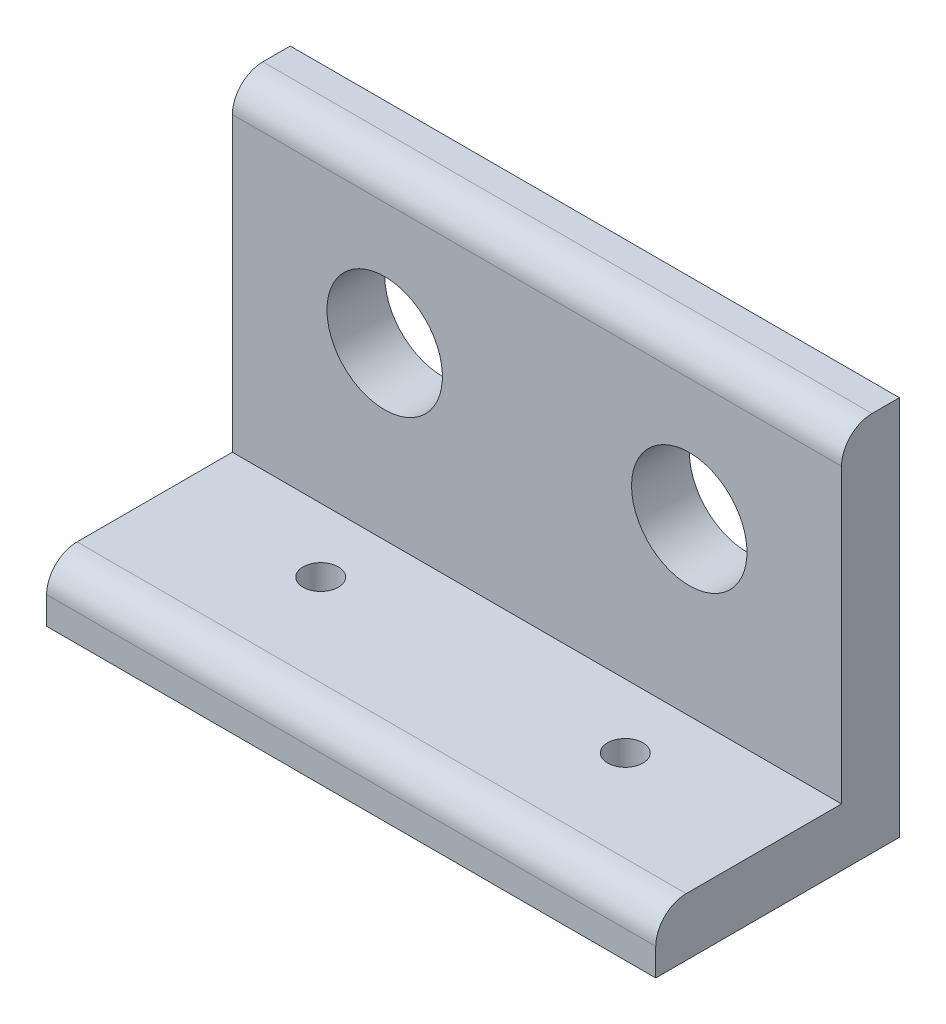
ISO-10303-21;
HEADER;
FILE_DESCRIPTION(('STEP AP214'),'2;1');
FILE_NAME('part.step','',(''),(''),'','','');
FILE_SCHEMA(('AUTOMOTIVE_DESIGN { 1 0 10303 214 1 1 1 1 }'));
ENDSEC;
DATA;
#1=APPLICATION_CONTEXT('core data for automotive mechanical design processes');
#2=APPLICATION_PROTOCOL_DEFINITION('international standard','automotive_design',2000,#1);
#3=PRODUCT_CONTEXT('',#1,'mechanical');
#4=PRODUCT('Part','Part','',(#3));
#5=PRODUCT_RELATED_PRODUCT_CATEGORY('part','',(#4));
#6=PRODUCT_DEFINITION_FORMATION('','',#4);
#7=PRODUCT_DEFINITION_CONTEXT('part definition',#1,'design');
#8=PRODUCT_DEFINITION('design','',#6,#7);
#9=PRODUCT_DEFINITION_SHAPE('','',#8);
#10=(LENGTH_UNIT() NAMED_UNIT(*) SI_UNIT(.MILLI.,.METRE.));
#11=(NAMED_UNIT(*) PLANE_ANGLE_UNIT() SI_UNIT($,.RADIAN.));
#12=(NAMED_UNIT(*) SI_UNIT($,.STERADIAN.) SOLID_ANGLE_UNIT());
#13=UNCERTAINTY_MEASURE_WITH_UNIT(LENGTH_MEASURE(1.E-05),#10,'distance_accuracy_value','');
#14=(GEOMETRIC_REPRESENTATION_CONTEXT(3) GLOBAL_UNCERTAINTY_ASSIGNED_CONTEXT((#13)) GLOBAL_UNIT_ASSIGNED_CONTEXT((#10,
#11,#12)) REPRESENTATION_CONTEXT('',''));
#15=CARTESIAN_POINT('',(0.,0.,0.));
#16=DIRECTION('',(0.,0.,1.));
#17=DIRECTION('',(1.,0.,0.));
#18=AXIS2_PLACEMENT_3D('',#15,#16,#17);
#19=CARTESIAN_POINT('',(0.,4.826,0.));
#20=DIRECTION('',(0.,-1.,0.));
#21=DIRECTION('',(0.,0.,-1.));
#22=AXIS2_PLACEMENT_3D('',#19,#20,#21);
#23=PLANE('',#22);
#24=CARTESIAN_POINT('',(38.1,4.826,-10.16));
#25=DIRECTION('',(0.,1.,0.));
#26=DIRECTION('',(0.,0.,1.));
#27=AXIS2_PLACEMENT_3D('',#24,#25,#26);
#28=CIRCLE('',#27,1.4732);
#29=CARTESIAN_POINT('',(38.1,4.826,-8.6868));
#30=VERTEX_POINT('',#29);
#31=EDGE_CURVE('E144',#30,#30,#28,.T.);
#32=ORIENTED_EDGE('',*,*,#31,.F.);
#33=EDGE_LOOP('',(#32));
#34=FACE_BOUND('',#33,.T.);
#35=CARTESIAN_POINT('',(12.7,4.826,-10.16));
#36=DIRECTION('',(0.,1.,0.));
#37=DIRECTION('',(0.,0.,1.));
#38=AXIS2_PLACEMENT_3D('',#35,#36,#37);
#39=CIRCLE('',#38,1.4732);
#40=CARTESIAN_POINT('',(12.7,4.826,-8.6868));
#41=VERTEX_POINT('',#40);
#42=EDGE_CURVE('E150',#41,#41,#39,.T.);
#43=ORIENTED_EDGE('',*,*,#42,.F.);
#44=EDGE_LOOP('',(#43));
#45=FACE_BOUND('',#44,.T.);
#46=DIRECTION('',(0.,0.,1.));
#47=VECTOR('',#46,1.);
#48=CARTESIAN_POINT('',(0.,4.826,0.));
#49=LINE('',#48,#47);
#50=CARTESIAN_POINT('',(0.,4.826,-15.494));
#51=VERTEX_POINT('',#50);
#52=CARTESIAN_POINT('',(0.,4.826,-2.54));
#53=VERTEX_POINT('',#52);
#54=EDGE_CURVE('E156',#51,#53,#49,.T.);
#55=ORIENTED_EDGE('',*,*,#54,.T.);
#56=DIRECTION('',(1.,0.,0.));
#57=VECTOR('',#56,1.);
#58=CARTESIAN_POINT('',(0.,4.826,-2.54));
#59=LINE('',#58,#57);
#60=CARTESIAN_POINT('',(50.8,4.826,-2.54));
#61=VERTEX_POINT('',#60);
#62=EDGE_CURVE('E174',#53,#61,#59,.T.);
#63=ORIENTED_EDGE('',*,*,#62,.T.);
#64=DIRECTION('',(0.,0.,-1.));
#65=VECTOR('',#64,1.);
#66=CARTESIAN_POINT('',(50.8,4.826,0.));
#67=LINE('',#66,#65);
#68=CARTESIAN_POINT('',(50.8,4.826,-15.494));
#69=VERTEX_POINT('',#68);
#70=EDGE_CURVE('E159',#61,#69,#67,.T.);
#71=ORIENTED_EDGE('',*,*,#70,.T.);
#72=DIRECTION('',(1.,0.,0.));
#73=VECTOR('',#72,1.);
#74=CARTESIAN_POINT('',(0.,4.826,-15.494));
#75=LINE('',#74,#73);
#76=EDGE_CURVE('E139',#51,#69,#75,.T.);
#77=ORIENTED_EDGE('',*,*,#76,.F.);
#78=EDGE_LOOP('',(#55,#63,#71,#77));
#79=FACE_BOUND('',#78,.T.);
#80=ADVANCED_FACE('F43',(#34,#45,#79),#23,.F.);
#81=CARTESIAN_POINT('',(0.,0.,0.));
#82=DIRECTION('',(0.,-1.,0.));
#83=DIRECTION('',(0.,0.,-1.));
#84=AXIS2_PLACEMENT_3D('',#81,#82,#83);
#85=PLANE('',#84);
#86=CARTESIAN_POINT('',(12.7,0.,-10.16));
#87=DIRECTION('',(0.,1.,0.));
#88=DIRECTION('',(0.,0.,1.));
#89=AXIS2_PLACEMENT_3D('',#86,#87,#88);
#90=CIRCLE('',#89,1.4732);
#91=CARTESIAN_POINT('',(12.7,0.,-8.6868));
#92=VERTEX_POINT('',#91);
#93=EDGE_CURVE('E147',#92,#92,#90,.T.);
#94=ORIENTED_EDGE('',*,*,#93,.T.);
#95=EDGE_LOOP('',(#94));
#96=FACE_BOUND('',#95,.T.);
#97=DIRECTION('',(0.,0.,1.));
#98=VECTOR('',#97,1.);
#99=CARTESIAN_POINT('',(0.,0.,0.));
#100=LINE('',#99,#98);
#101=CARTESIAN_POINT('',(0.,0.,-20.32));
#102=VERTEX_POINT('',#101);
#103=CARTESIAN_POINT('',(0.,0.,0.));
#104=VERTEX_POINT('',#103);
#105=EDGE_CURVE('E153',#102,#104,#100,.T.);
#106=ORIENTED_EDGE('',*,*,#105,.F.);
#107=DIRECTION('',(-1.,0.,0.));
#108=VECTOR('',#107,1.);
#109=CARTESIAN_POINT('',(0.,0.,-20.32));
#110=LINE('',#109,#108);
#111=CARTESIAN_POINT('',(50.8,0.,-20.32));
#112=VERTEX_POINT('',#111);
#113=EDGE_CURVE('E160',#112,#102,#110,.T.);
#114=ORIENTED_EDGE('',*,*,#113,.F.);
#115=DIRECTION('',(0.,0.,-1.));
#116=VECTOR('',#115,1.);
#117=CARTESIAN_POINT('',(50.8,0.,0.));
#118=LINE('',#117,#116);
#119=CARTESIAN_POINT('',(50.8,0.,0.));
#120=VERTEX_POINT('',#119);
#121=EDGE_CURVE('E125',#120,#112,#118,.T.);
#122=ORIENTED_EDGE('',*,*,#121,.F.);
#123=DIRECTION('',(1.,0.,0.));
#124=VECTOR('',#123,1.);
#125=CARTESIAN_POINT('',(0.,0.,0.));
#126=LINE('',#125,#124);
#127=EDGE_CURVE('E165',#104,#120,#126,.T.);
#128=ORIENTED_EDGE('',*,*,#127,.F.);
#129=EDGE_LOOP('',(#106,#114,#122,#128));
#130=FACE_BOUND('',#129,.T.);
#131=CARTESIAN_POINT('',(38.1,0.,-10.16));
#132=DIRECTION('',(0.,1.,0.));
#133=DIRECTION('',(0.,0.,1.));
#134=AXIS2_PLACEMENT_3D('',#131,#132,#133);
#135=CIRCLE('',#134,1.4732);
#136=CARTESIAN_POINT('',(38.1,0.,-8.6868));
#137=VERTEX_POINT('',#136);
#138=EDGE_CURVE('E143',#137,#137,#135,.T.);
#139=ORIENTED_EDGE('',*,*,#138,.T.);
#140=EDGE_LOOP('',(#139));
#141=FACE_BOUND('',#140,.T.);
#142=ADVANCED_FACE('F217',(#96,#130,#141),#85,.T.);
#143=CARTESIAN_POINT('',(0.,4.826,0.));
#144=DIRECTION('',(1.,0.,0.));
#145=DIRECTION('',(0.,0.,-1.));
#146=AXIS2_PLACEMENT_3D('',#143,#144,#145);
#147=PLANE('',#146);
#148=DIRECTION('',(0.,-1.,0.));
#149=VECTOR('',#148,1.);
#150=CARTESIAN_POINT('',(0.,4.826,0.));
#151=LINE('',#150,#149);
#152=CARTESIAN_POINT('',(0.,2.286,0.));
#153=VERTEX_POINT('',#152);
#154=EDGE_CURVE('E172',#153,#104,#151,.T.);
#155=ORIENTED_EDGE('',*,*,#154,.F.);
#156=CARTESIAN_POINT('',(0.,2.286,-2.54));
#157=DIRECTION('',(1.,0.,0.));
#158=DIRECTION('',(0.,0.,-1.));
#159=AXIS2_PLACEMENT_3D('',#156,#157,#158);
#160=CIRCLE('',#159,2.54);
#161=EDGE_CURVE('E184',#153,#53,#160,.F.);
#162=ORIENTED_EDGE('',*,*,#161,.T.);
#163=ORIENTED_EDGE('',*,*,#54,.F.);
#164=DIRECTION('',(0.,-1.,0.));
#165=VECTOR('',#164,1.);
#166=CARTESIAN_POINT('',(0.,31.75,-15.494));
#167=LINE('',#166,#165);
#168=CARTESIAN_POINT('',(0.,29.21,-15.494));
#169=VERTEX_POINT('',#168);
#170=EDGE_CURVE('E135',#169,#51,#167,.T.);
#171=ORIENTED_EDGE('',*,*,#170,.F.);
#172=CARTESIAN_POINT('',(0.,29.21,-18.034));
#173=DIRECTION('',(1.,0.,0.));
#174=DIRECTION('',(0.,0.,-1.));
#175=AXIS2_PLACEMENT_3D('',#172,#173,#174);
#176=CIRCLE('',#175,2.54);
#177=CARTESIAN_POINT('',(0.,31.75,-18.034));
#178=VERTEX_POINT('',#177);
#179=EDGE_CURVE('E60',#169,#178,#176,.F.);
#180=ORIENTED_EDGE('',*,*,#179,.T.);
#181=DIRECTION('',(0.,0.,1.));
#182=VECTOR('',#181,1.);
#183=CARTESIAN_POINT('',(0.,31.75,-20.32));
#184=LINE('',#183,#182);
#185=CARTESIAN_POINT('',(0.,31.75,-20.32));
#186=VERTEX_POINT('',#185);
#187=EDGE_CURVE('E118',#186,#178,#184,.T.);
#188=ORIENTED_EDGE('',*,*,#187,.F.);
#189=DIRECTION('',(0.,-1.,0.));
#190=VECTOR('',#189,1.);
#191=CARTESIAN_POINT('',(0.,4.826,-20.32));
#192=LINE('',#191,#190);
#193=EDGE_CURVE('E129',#186,#102,#192,.T.);
#194=ORIENTED_EDGE('',*,*,#193,.T.);
#195=ORIENTED_EDGE('',*,*,#105,.T.);
#196=EDGE_LOOP('',(#155,#162,#163,#171,#180,#188,#194,#195));
#197=FACE_BOUND('',#196,.T.);
#198=ADVANCED_FACE('F206',(#197),#147,.F.);
#199=CARTESIAN_POINT('',(0.,4.826,0.));
#200=DIRECTION('',(0.,0.,-1.));
#201=DIRECTION('',(-1.,0.,0.));
#202=AXIS2_PLACEMENT_3D('',#199,#200,#201);
#203=PLANE('',#202);
#204=DIRECTION('',(0.,-1.,0.));
#205=VECTOR('',#204,1.);
#206=CARTESIAN_POINT('',(50.8,4.826,0.));
#207=LINE('',#206,#205);
#208=CARTESIAN_POINT('',(50.8,2.286,0.));
#209=VERTEX_POINT('',#208);
#210=EDGE_CURVE('E128',#209,#120,#207,.T.);
#211=ORIENTED_EDGE('',*,*,#210,.F.);
#212=DIRECTION('',(1.,0.,0.));
#213=VECTOR('',#212,1.);
#214=CARTESIAN_POINT('',(0.,2.286,0.));
#215=LINE('',#214,#213);
#216=EDGE_CURVE('E181',#209,#153,#215,.F.);
#217=ORIENTED_EDGE('',*,*,#216,.T.);
#218=ORIENTED_EDGE('',*,*,#154,.T.);
#219=ORIENTED_EDGE('',*,*,#127,.T.);
#220=EDGE_LOOP('',(#211,#217,#218,#219));
#221=FACE_BOUND('',#220,.T.);
#222=ADVANCED_FACE('F213',(#221),#203,.F.);
#223=CARTESIAN_POINT('',(50.8,4.826,0.));
#224=DIRECTION('',(-1.,0.,0.));
#225=DIRECTION('',(0.,0.,1.));
#226=AXIS2_PLACEMENT_3D('',#223,#224,#225);
#227=PLANE('',#226);
#228=ORIENTED_EDGE('',*,*,#70,.F.);
#229=CARTESIAN_POINT('',(50.8,2.286,-2.54));
#230=DIRECTION('',(-1.,0.,0.));
#231=DIRECTION('',(0.,0.,1.));
#232=AXIS2_PLACEMENT_3D('',#229,#230,#231);
#233=CIRCLE('',#232,2.54);
#234=EDGE_CURVE('E179',#61,#209,#233,.F.);
#235=ORIENTED_EDGE('',*,*,#234,.T.);
#236=ORIENTED_EDGE('',*,*,#210,.T.);
#237=ORIENTED_EDGE('',*,*,#121,.T.);
#238=DIRECTION('',(0.,-1.,0.));
#239=VECTOR('',#238,1.);
#240=CARTESIAN_POINT('',(50.8,4.826,-20.32));
#241=LINE('',#240,#239);
#242=CARTESIAN_POINT('',(50.8,31.75,-20.32));
#243=VERTEX_POINT('',#242);
#244=EDGE_CURVE('E121',#243,#112,#241,.T.);
#245=ORIENTED_EDGE('',*,*,#244,.F.);
#246=DIRECTION('',(0.,0.,-1.));
#247=VECTOR('',#246,1.);
#248=CARTESIAN_POINT('',(50.8,31.75,-20.32));
#249=LINE('',#248,#247);
#250=CARTESIAN_POINT('',(50.8,31.75,-18.034));
#251=VERTEX_POINT('',#250);
#252=EDGE_CURVE('E111',#251,#243,#249,.T.);
#253=ORIENTED_EDGE('',*,*,#252,.F.);
#254=CARTESIAN_POINT('',(50.8,29.21,-18.034));
#255=DIRECTION('',(-1.,0.,0.));
#256=DIRECTION('',(0.,0.,1.));
#257=AXIS2_PLACEMENT_3D('',#254,#255,#256);
#258=CIRCLE('',#257,2.54);
#259=CARTESIAN_POINT('',(50.8,29.21,-15.494));
#260=VERTEX_POINT('',#259);
#261=EDGE_CURVE('E177',#251,#260,#258,.F.);
#262=ORIENTED_EDGE('',*,*,#261,.T.);
#263=DIRECTION('',(0.,-1.,0.));
#264=VECTOR('',#263,1.);
#265=CARTESIAN_POINT('',(50.8,31.75,-15.494));
#266=LINE('',#265,#264);
#267=EDGE_CURVE('E133',#260,#69,#266,.T.);
#268=ORIENTED_EDGE('',*,*,#267,.T.);
#269=EDGE_LOOP('',(#228,#235,#236,#237,#245,#253,#262,#268));
#270=FACE_BOUND('',#269,.T.);
#271=ADVANCED_FACE('F123',(#270),#227,.F.);
#272=CARTESIAN_POINT('',(0.,4.826,-20.32));
#273=DIRECTION('',(0.,0.,1.));
#274=DIRECTION('',(1.,0.,0.));
#275=AXIS2_PLACEMENT_3D('',#272,#273,#274);
#276=PLANE('',#275);
#277=CARTESIAN_POINT('',(38.1,19.05,-20.32));
#278=DIRECTION('',(0.,0.,-1.));
#279=DIRECTION('',(-1.,0.,0.));
#280=AXIS2_PLACEMENT_3D('',#277,#278,#279);
#281=CIRCLE('',#280,4.8133);
#282=CARTESIAN_POINT('',(33.2867,19.05,-20.32));
#283=VERTEX_POINT('',#282);
#284=EDGE_CURVE('E188',#283,#283,#281,.T.);
#285=ORIENTED_EDGE('',*,*,#284,.F.);
#286=EDGE_LOOP('',(#285));
#287=FACE_BOUND('',#286,.T.);
#288=CARTESIAN_POINT('',(12.7,19.05,-20.32));
#289=DIRECTION('',(0.,0.,-1.));
#290=DIRECTION('',(-1.,0.,0.));
#291=AXIS2_PLACEMENT_3D('',#288,#289,#290);
#292=CIRCLE('',#291,4.8133);
#293=CARTESIAN_POINT('',(7.8867,19.05,-20.32));
#294=VERTEX_POINT('',#293);
#295=EDGE_CURVE('E193',#294,#294,#292,.T.);
#296=ORIENTED_EDGE('',*,*,#295,.F.);
#297=EDGE_LOOP('',(#296));
#298=FACE_BOUND('',#297,.T.);
#299=ORIENTED_EDGE('',*,*,#113,.T.);
#300=ORIENTED_EDGE('',*,*,#193,.F.);
#301=DIRECTION('',(-1.,0.,0.));
#302=VECTOR('',#301,1.);
#303=CARTESIAN_POINT('',(0.,31.75,-20.32));
#304=LINE('',#303,#302);
#305=EDGE_CURVE('E115',#243,#186,#304,.T.);
#306=ORIENTED_EDGE('',*,*,#305,.F.);
#307=ORIENTED_EDGE('',*,*,#244,.T.);
#308=EDGE_LOOP('',(#299,#300,#306,#307));
#309=FACE_BOUND('',#308,.T.);
#310=ADVANCED_FACE('F131',(#287,#298,#309),#276,.F.);
#311=CARTESIAN_POINT('',(12.7,4.826,-10.16));
#312=DIRECTION('',(0.,-1.,0.));
#313=DIRECTION('',(0.,0.,-1.));
#314=AXIS2_PLACEMENT_3D('',#311,#312,#313);
#315=CYLINDRICAL_SURFACE('',#314,1.4732);
#316=ORIENTED_EDGE('',*,*,#42,.T.);
#317=EDGE_LOOP('',(#316));
#318=FACE_BOUND('',#317,.T.);
#319=ORIENTED_EDGE('',*,*,#93,.F.);
#320=EDGE_LOOP('',(#319));
#321=FACE_BOUND('',#320,.T.);
#322=ADVANCED_FACE('F226',(#318,#321),#315,.F.);
#323=CARTESIAN_POINT('',(38.1,4.826,-10.16));
#324=DIRECTION('',(0.,-1.,0.));
#325=DIRECTION('',(0.,0.,-1.));
#326=AXIS2_PLACEMENT_3D('',#323,#324,#325);
#327=CYLINDRICAL_SURFACE('',#326,1.4732);
#328=ORIENTED_EDGE('',*,*,#31,.T.);
#329=EDGE_LOOP('',(#328));
#330=FACE_BOUND('',#329,.T.);
#331=ORIENTED_EDGE('',*,*,#138,.F.);
#332=EDGE_LOOP('',(#331));
#333=FACE_BOUND('',#332,.T.);
#334=ADVANCED_FACE('F224',(#330,#333),#327,.F.);
#335=CARTESIAN_POINT('',(0.,31.75,-15.494));
#336=DIRECTION('',(0.,0.,-1.));
#337=DIRECTION('',(-1.,0.,0.));
#338=AXIS2_PLACEMENT_3D('',#335,#336,#337);
#339=PLANE('',#338);
#340=CARTESIAN_POINT('',(38.1,19.05,-15.494));
#341=DIRECTION('',(0.,0.,-1.));
#342=DIRECTION('',(-1.,0.,0.));
#343=AXIS2_PLACEMENT_3D('',#340,#341,#342);
#344=CIRCLE('',#343,4.8133);
#345=CARTESIAN_POINT('',(33.2867,19.05,-15.494));
#346=VERTEX_POINT('',#345);
#347=EDGE_CURVE('E47',#346,#346,#344,.T.);
#348=ORIENTED_EDGE('',*,*,#347,.T.);
#349=EDGE_LOOP('',(#348));
#350=FACE_BOUND('',#349,.T.);
#351=CARTESIAN_POINT('',(12.7,19.05,-15.494));
#352=DIRECTION('',(0.,0.,-1.));
#353=DIRECTION('',(-1.,0.,0.));
#354=AXIS2_PLACEMENT_3D('',#351,#352,#353);
#355=CIRCLE('',#354,4.8133);
#356=CARTESIAN_POINT('',(7.8867,19.05,-15.494));
#357=VERTEX_POINT('',#356);
#358=EDGE_CURVE('E186',#357,#357,#355,.T.);
#359=ORIENTED_EDGE('',*,*,#358,.T.);
#360=EDGE_LOOP('',(#359));
#361=FACE_BOUND('',#360,.T.);
#362=ORIENTED_EDGE('',*,*,#267,.F.);
#363=DIRECTION('',(1.,0.,0.));
#364=VECTOR('',#363,1.);
#365=CARTESIAN_POINT('',(0.,29.21,-15.494));
#366=LINE('',#365,#364);
#367=EDGE_CURVE('E11',#260,#169,#366,.F.);
#368=ORIENTED_EDGE('',*,*,#367,.T.);
#369=ORIENTED_EDGE('',*,*,#170,.T.);
#370=ORIENTED_EDGE('',*,*,#76,.T.);
#371=EDGE_LOOP('',(#362,#368,#369,#370));
#372=FACE_BOUND('',#371,.T.);
#373=ADVANCED_FACE('F200',(#350,#361,#372),#339,.F.);
#374=CARTESIAN_POINT('',(0.,31.75,0.));
#375=DIRECTION('',(0.,1.,0.));
#376=DIRECTION('',(0.,0.,1.));
#377=AXIS2_PLACEMENT_3D('',#374,#375,#376);
#378=PLANE('',#377);
#379=ORIENTED_EDGE('',*,*,#187,.T.);
#380=DIRECTION('',(1.,0.,0.));
#381=VECTOR('',#380,1.);
#382=CARTESIAN_POINT('',(50.8,31.75,-18.034));
#383=LINE('',#382,#381);
#384=EDGE_CURVE('E52',#178,#251,#383,.T.);
#385=ORIENTED_EDGE('',*,*,#384,.T.);
#386=ORIENTED_EDGE('',*,*,#252,.T.);
#387=ORIENTED_EDGE('',*,*,#305,.T.);
#388=EDGE_LOOP('',(#379,#385,#386,#387));
#389=FACE_BOUND('',#388,.T.);
#390=ADVANCED_FACE('F113',(#389),#378,.T.);
#391=CARTESIAN_POINT('',(0.,2.286,-2.54));
#392=DIRECTION('',(1.,0.,0.));
#393=DIRECTION('',(0.,0.,-1.));
#394=AXIS2_PLACEMENT_3D('',#391,#392,#393);
#395=CYLINDRICAL_SURFACE('',#394,2.54);
#396=ORIENTED_EDGE('',*,*,#161,.F.);
#397=ORIENTED_EDGE('',*,*,#216,.F.);
#398=ORIENTED_EDGE('',*,*,#234,.F.);
#399=ORIENTED_EDGE('',*,*,#62,.F.);
#400=EDGE_LOOP('',(#396,#397,#398,#399));
#401=FACE_BOUND('',#400,.T.);
#402=ADVANCED_FACE('F210',(#401),#395,.T.);
#403=CARTESIAN_POINT('',(0.,29.21,-18.034));
#404=DIRECTION('',(-1.,0.,0.));
#405=DIRECTION('',(0.,0.,1.));
#406=AXIS2_PLACEMENT_3D('',#403,#404,#405);
#407=CYLINDRICAL_SURFACE('',#406,2.54);
#408=ORIENTED_EDGE('',*,*,#179,.F.);
#409=ORIENTED_EDGE('',*,*,#367,.F.);
#410=ORIENTED_EDGE('',*,*,#261,.F.);
#411=ORIENTED_EDGE('',*,*,#384,.F.);
#412=EDGE_LOOP('',(#408,#409,#410,#411));
#413=FACE_BOUND('',#412,.T.);
#414=ADVANCED_FACE('F45',(#413),#407,.T.);
#415=CARTESIAN_POINT('',(12.7,19.05,6.604));
#416=DIRECTION('',(0.,0.,-1.));
#417=DIRECTION('',(-1.,0.,0.));
#418=AXIS2_PLACEMENT_3D('',#415,#416,#417);
#419=CYLINDRICAL_SURFACE('',#418,4.8133);
#420=ORIENTED_EDGE('',*,*,#295,.T.);
#421=EDGE_LOOP('',(#420));
#422=FACE_BOUND('',#421,.T.);
#423=ORIENTED_EDGE('',*,*,#358,.F.);
#424=EDGE_LOOP('',(#423));
#425=FACE_BOUND('',#424,.T.);
#426=ADVANCED_FACE('F258',(#422,#425),#419,.F.);
#427=CARTESIAN_POINT('',(38.1,19.05,6.604));
#428=DIRECTION('',(0.,0.,-1.));
#429=DIRECTION('',(-1.,0.,0.));
#430=AXIS2_PLACEMENT_3D('',#427,#428,#429);
#431=CYLINDRICAL_SURFACE('',#430,4.8133);
#432=ORIENTED_EDGE('',*,*,#284,.T.);
#433=EDGE_LOOP('',(#432));
#434=FACE_BOUND('',#433,.T.);
#435=ORIENTED_EDGE('',*,*,#347,.F.);
#436=EDGE_LOOP('',(#435));
#437=FACE_BOUND('',#436,.T.);
#438=ADVANCED_FACE('F265',(#434,#437),#431,.F.);
#439=CLOSED_SHELL('',(#80,#142,#198,#222,#271,#310,#322,#334,#373,#390,#402,#414,#426,#438));
#440=MANIFOLD_SOLID_BREP('B2',#439);
#441=ADVANCED_BREP_SHAPE_REPRESENTATION('',(#18,#440),#14);
#442=SHAPE_DEFINITION_REPRESENTATION(#9,#441);
ENDSEC;
END-ISO-10303-21;
